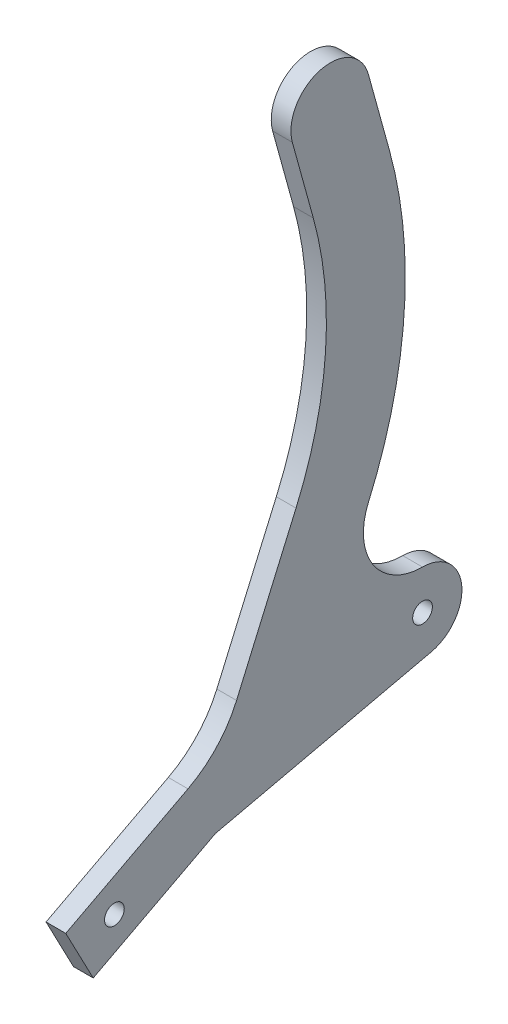
ISO-10303-21;
HEADER;
FILE_DESCRIPTION(('STEP AP214'),'2;1');
FILE_NAME('part.step','',(''),(''),'','','');
FILE_SCHEMA(('AUTOMOTIVE_DESIGN { 1 0 10303 214 1 1 1 1 }'));
ENDSEC;
DATA;
#1=APPLICATION_CONTEXT('core data for automotive mechanical design processes');
#2=APPLICATION_PROTOCOL_DEFINITION('international standard','automotive_design',2000,#1);
#3=PRODUCT_CONTEXT('',#1,'mechanical');
#4=PRODUCT('Part','Part','',(#3));
#5=PRODUCT_RELATED_PRODUCT_CATEGORY('part','',(#4));
#6=PRODUCT_DEFINITION_FORMATION('','',#4);
#7=PRODUCT_DEFINITION_CONTEXT('part definition',#1,'design');
#8=PRODUCT_DEFINITION('design','',#6,#7);
#9=PRODUCT_DEFINITION_SHAPE('','',#8);
#10=(LENGTH_UNIT() NAMED_UNIT(*) SI_UNIT(.MILLI.,.METRE.));
#11=(NAMED_UNIT(*) PLANE_ANGLE_UNIT() SI_UNIT($,.RADIAN.));
#12=(NAMED_UNIT(*) SI_UNIT($,.STERADIAN.) SOLID_ANGLE_UNIT());
#13=UNCERTAINTY_MEASURE_WITH_UNIT(LENGTH_MEASURE(1.E-05),#10,'distance_accuracy_value','');
#14=(GEOMETRIC_REPRESENTATION_CONTEXT(3) GLOBAL_UNCERTAINTY_ASSIGNED_CONTEXT((#13)) GLOBAL_UNIT_ASSIGNED_CONTEXT((#10,
#11,#12)) REPRESENTATION_CONTEXT('',''));
#15=CARTESIAN_POINT('',(0.,0.,0.));
#16=DIRECTION('',(0.,0.,1.));
#17=DIRECTION('',(1.,0.,0.));
#18=AXIS2_PLACEMENT_3D('',#15,#16,#17);
#19=CARTESIAN_POINT('',(6.35,155.517192161729,29.6872873156729));
#20=DIRECTION('',(-1.,0.,0.));
#21=DIRECTION('',(0.,0.,1.));
#22=AXIS2_PLACEMENT_3D('',#19,#20,#21);
#23=PLANE('',#22);
#24=CARTESIAN_POINT('',(6.35,155.517192161729,29.6872873156729));
#25=DIRECTION('',(1.,0.,0.));
#26=DIRECTION('',(0.,0.,1.));
#27=AXIS2_PLACEMENT_3D('',#24,#25,#26);
#28=CIRCLE('',#27,12.7);
#29=CARTESIAN_POINT('',(6.35,158.891526489611,17.4437638096035));
#30=VERTEX_POINT('',#29);
#31=CARTESIAN_POINT('',(6.35,152.142857833885,41.930810821753));
#32=VERTEX_POINT('',#31);
#33=EDGE_CURVE('E187',#30,#32,#28,.T.);
#34=ORIENTED_EDGE('',*,*,#33,.T.);
#35=DIRECTION('',(0.,-0.964056968982683,-0.26569561636565));
#36=VECTOR('',#35,1.);
#37=CARTESIAN_POINT('',(6.35,139.899334327844,38.5564764939199));
#38=LINE('',#37,#36);
#39=CARTESIAN_POINT('',(6.35,127.65581082176,35.1821421660333));
#40=VERTEX_POINT('',#39);
#41=EDGE_CURVE('E110',#32,#40,#38,.T.);
#42=ORIENTED_EDGE('',*,*,#41,.T.);
#43=CARTESIAN_POINT('',(6.35,96.4492040395704,148.413015743073));
#44=DIRECTION('',(-1.,0.,0.));
#45=DIRECTION('',(0.,0.,1.));
#46=AXIS2_PLACEMENT_3D('',#43,#44,#45);
#47=CIRCLE('',#46,117.452471399522);
#48=CARTESIAN_POINT('',(6.35,49.5130371835725,40.7464969049429));
#49=VERTEX_POINT('',#48);
#50=EDGE_CURVE('E217',#40,#49,#47,.T.);
#51=ORIENTED_EDGE('',*,*,#50,.T.);
#52=CARTESIAN_POINT('',(6.35,-8939.85125845333,-20579.8884016774));
#53=DIRECTION('',(1.,0.,0.));
#54=DIRECTION('',(0.,0.,-1.));
#55=AXIS2_PLACEMENT_3D('',#52,#53,#54);
#56=CIRCLE('',#55,22494.8717280249);
#57=CARTESIAN_POINT('',(6.35,5.43808472283835,59.9045388332975));
#58=VERTEX_POINT('',#57);
#59=EDGE_CURVE('E236',#49,#58,#56,.T.);
#60=ORIENTED_EDGE('',*,*,#59,.T.);
#61=CARTESIAN_POINT('',(6.35,19.1579657181966,91.5609215447985));
#62=DIRECTION('',(-1.,0.,0.));
#63=DIRECTION('',(0.,0.,1.));
#64=AXIS2_PLACEMENT_3D('',#61,#62,#63);
#65=CIRCLE('',#64,34.5016188159517);
#66=CARTESIAN_POINT('',(6.35,-11.4021066879984,75.5470626891276));
#67=VERTEX_POINT('',#66);
#68=EDGE_CURVE('E233',#58,#67,#65,.T.);
#69=ORIENTED_EDGE('',*,*,#68,.T.);
#70=DIRECTION('',(0.,-0.464148043055454,0.8857576384812));
#71=VECTOR('',#70,1.);
#72=CARTESIAN_POINT('',(6.35,-11.4021066879973,75.5470626891281));
#73=LINE('',#72,#71);
#74=CARTESIAN_POINT('',(6.35,-32.0334872017881,114.918989719571));
#75=VERTEX_POINT('',#74);
#76=EDGE_CURVE('E235',#67,#75,#73,.T.);
#77=ORIENTED_EDGE('',*,*,#76,.T.);
#78=DIRECTION('',(0.,-0.8857576384812,-0.464148043055454));
#79=VECTOR('',#78,1.);
#80=CARTESIAN_POINT('',(6.35,-32.0334872017881,114.918989719571));
#81=LINE('',#80,#79);
#82=CARTESIAN_POINT('',(6.35,-48.9071702148215,106.076969499382));
#83=VERTEX_POINT('',#82);
#84=EDGE_CURVE('E238',#75,#83,#81,.T.);
#85=ORIENTED_EDGE('',*,*,#84,.T.);
#86=DIRECTION('',(0.,0.464148043055454,-0.8857576384812));
#87=VECTOR('',#86,1.);
#88=CARTESIAN_POINT('',(6.35,-48.9071702148215,106.076969499382));
#89=LINE('',#88,#87);
#90=CARTESIAN_POINT('',(6.35,-28.2757897010066,66.705042468893));
#91=VERTEX_POINT('',#90);
#92=EDGE_CURVE('E244',#83,#91,#89,.T.);
#93=ORIENTED_EDGE('',*,*,#92,.T.);
#94=DIRECTION('',(0.,0.222843337829662,-0.974854269511569));
#95=VECTOR('',#94,1.);
#96=CARTESIAN_POINT('',(6.35,-28.2757897010066,66.705042468893));
#97=LINE('',#96,#95);
#98=CARTESIAN_POINT('',(6.35,-12.3806492227971,-2.83011039043598));
#99=VERTEX_POINT('',#98);
#100=EDGE_CURVE('E246',#91,#99,#97,.T.);
#101=ORIENTED_EDGE('',*,*,#100,.T.);
#102=CARTESIAN_POINT('',(6.35,0.,0.));
#103=DIRECTION('',(1.,0.,0.));
#104=DIRECTION('',(0.,0.,-1.));
#105=AXIS2_PLACEMENT_3D('',#102,#103,#104);
#106=CIRCLE('',#105,12.7000000000044);
#107=CARTESIAN_POINT('',(6.35,12.7000000000044,4.65173894454087E-11));
#108=VERTEX_POINT('',#107);
#109=EDGE_CURVE('E144',#99,#108,#106,.T.);
#110=ORIENTED_EDGE('',*,*,#109,.T.);
#111=CARTESIAN_POINT('',(6.35,31.7500000000319,1.16335480160485E-10));
#112=DIRECTION('',(-1.,0.,0.));
#113=DIRECTION('',(0.,0.,1.));
#114=AXIS2_PLACEMENT_3D('',#111,#112,#113);
#115=CIRCLE('',#114,19.0500000000426);
#116=CARTESIAN_POINT('',(6.35,39.3627302215487,17.4627843879518));
#117=VERTEX_POINT('',#116);
#118=EDGE_CURVE('E138',#108,#117,#115,.T.);
#119=ORIENTED_EDGE('',*,*,#118,.T.);
#120=CARTESIAN_POINT('',(6.35,96.4492040395463,148.41301574316));
#121=DIRECTION('',(1.,0.,0.));
#122=DIRECTION('',(0.,0.,1.));
#123=AXIS2_PLACEMENT_3D('',#120,#121,#122);
#124=CIRCLE('',#123,142.852471399592);
#125=CARTESIAN_POINT('',(6.35,134.404479477431,10.6950951539879));
#126=VERTEX_POINT('',#125);
#127=EDGE_CURVE('E142',#117,#126,#124,.T.);
#128=ORIENTED_EDGE('',*,*,#127,.T.);
#129=DIRECTION('',(0.,0.964056968982683,0.265695616365651));
#130=VECTOR('',#129,1.);
#131=CARTESIAN_POINT('',(6.35,158.891526489611,17.4437638096035));
#132=LINE('',#131,#130);
#133=EDGE_CURVE('E52',#126,#30,#132,.T.);
#134=ORIENTED_EDGE('',*,*,#133,.T.);
#135=EDGE_LOOP('',(#34,#42,#51,#60,#69,#77,#85,#93,#101,#110,#119,#128,#134));
#136=FACE_BOUND('',#135,.T.);
#137=CARTESIAN_POINT('',(6.35,0.,0.));
#138=DIRECTION('',(1.,0.,0.));
#139=DIRECTION('',(0.,0.,-1.));
#140=AXIS2_PLACEMENT_3D('',#137,#138,#139);
#141=CIRCLE('',#140,3.175);
#142=CARTESIAN_POINT('',(6.35,0.,-3.175));
#143=VERTEX_POINT('',#142);
#144=EDGE_CURVE('E166',#143,#143,#141,.T.);
#145=ORIENTED_EDGE('',*,*,#144,.F.);
#146=EDGE_LOOP('',(#145));
#147=FACE_BOUND('',#146,.T.);
#148=CARTESIAN_POINT('',(6.35,-34.5756485615007,99.2488576007703));
#149=DIRECTION('',(1.,0.,0.));
#150=DIRECTION('',(0.,0.,-1.));
#151=AXIS2_PLACEMENT_3D('',#148,#149,#150);
#152=CIRCLE('',#151,3.1749999999681);
#153=CARTESIAN_POINT('',(6.35,-34.5756485615007,96.0738576008022));
#154=VERTEX_POINT('',#153);
#155=EDGE_CURVE('E287',#154,#154,#152,.T.);
#156=ORIENTED_EDGE('',*,*,#155,.F.);
#157=EDGE_LOOP('',(#156));
#158=FACE_BOUND('',#157,.T.);
#159=ADVANCED_FACE('F35',(#136,#147,#158),#23,.F.);
#160=CARTESIAN_POINT('',(0.,155.517192161729,29.6872873156729));
#161=DIRECTION('',(-1.,0.,0.));
#162=DIRECTION('',(0.,0.,1.));
#163=AXIS2_PLACEMENT_3D('',#160,#161,#162);
#164=PLANE('',#163);
#165=CARTESIAN_POINT('',(0.,0.,0.));
#166=DIRECTION('',(1.,0.,0.));
#167=DIRECTION('',(0.,0.,-1.));
#168=AXIS2_PLACEMENT_3D('',#165,#166,#167);
#169=CIRCLE('',#168,3.175);
#170=CARTESIAN_POINT('',(0.,0.,-3.175));
#171=VERTEX_POINT('',#170);
#172=EDGE_CURVE('E292',#171,#171,#169,.T.);
#173=ORIENTED_EDGE('',*,*,#172,.T.);
#174=EDGE_LOOP('',(#173));
#175=FACE_BOUND('',#174,.T.);
#176=CARTESIAN_POINT('',(0.,155.517192161729,29.6872873156729));
#177=DIRECTION('',(1.,0.,0.));
#178=DIRECTION('',(0.,0.,1.));
#179=AXIS2_PLACEMENT_3D('',#176,#177,#178);
#180=CIRCLE('',#179,12.7);
#181=CARTESIAN_POINT('',(0.,158.891526489611,17.4437638096035));
#182=VERTEX_POINT('',#181);
#183=CARTESIAN_POINT('',(0.,152.142857833885,41.930810821753));
#184=VERTEX_POINT('',#183);
#185=EDGE_CURVE('E162',#182,#184,#180,.T.);
#186=ORIENTED_EDGE('',*,*,#185,.F.);
#187=DIRECTION('',(0.,0.964056968982683,0.265695616365651));
#188=VECTOR('',#187,1.);
#189=CARTESIAN_POINT('',(0.,158.891526489611,17.4437638096035));
#190=LINE('',#189,#188);
#191=CARTESIAN_POINT('',(0.,134.404479477431,10.6950951539879));
#192=VERTEX_POINT('',#191);
#193=EDGE_CURVE('E102',#192,#182,#190,.T.);
#194=ORIENTED_EDGE('',*,*,#193,.F.);
#195=CARTESIAN_POINT('',(0.,96.4492040395463,148.41301574316));
#196=DIRECTION('',(1.,0.,0.));
#197=DIRECTION('',(0.,0.,1.));
#198=AXIS2_PLACEMENT_3D('',#195,#196,#197);
#199=CIRCLE('',#198,142.852471399592);
#200=CARTESIAN_POINT('',(0.,39.3627302215487,17.4627843879518));
#201=VERTEX_POINT('',#200);
#202=EDGE_CURVE('E96',#201,#192,#199,.T.);
#203=ORIENTED_EDGE('',*,*,#202,.F.);
#204=CARTESIAN_POINT('',(0.,31.7500000000319,1.16335480160485E-10));
#205=DIRECTION('',(-1.,0.,0.));
#206=DIRECTION('',(0.,0.,1.));
#207=AXIS2_PLACEMENT_3D('',#204,#205,#206);
#208=CIRCLE('',#207,19.0500000000426);
#209=CARTESIAN_POINT('',(0.,12.7000000000044,4.65173894454087E-11));
#210=VERTEX_POINT('',#209);
#211=EDGE_CURVE('E152',#210,#201,#208,.T.);
#212=ORIENTED_EDGE('',*,*,#211,.F.);
#213=CARTESIAN_POINT('',(0.,0.,0.));
#214=DIRECTION('',(1.,0.,0.));
#215=DIRECTION('',(0.,0.,-1.));
#216=AXIS2_PLACEMENT_3D('',#213,#214,#215);
#217=CIRCLE('',#216,12.7000000000044);
#218=CARTESIAN_POINT('',(0.,-12.3806492227971,-2.83011039043598));
#219=VERTEX_POINT('',#218);
#220=EDGE_CURVE('E182',#219,#210,#217,.T.);
#221=ORIENTED_EDGE('',*,*,#220,.F.);
#222=DIRECTION('',(0.,0.222843337829662,-0.974854269511569));
#223=VECTOR('',#222,1.);
#224=CARTESIAN_POINT('',(0.,-28.2757897010066,66.705042468893));
#225=LINE('',#224,#223);
#226=CARTESIAN_POINT('',(0.,-28.2757897010066,66.705042468893));
#227=VERTEX_POINT('',#226);
#228=EDGE_CURVE('E180',#227,#219,#225,.T.);
#229=ORIENTED_EDGE('',*,*,#228,.F.);
#230=DIRECTION('',(0.,0.464148043055454,-0.8857576384812));
#231=VECTOR('',#230,1.);
#232=CARTESIAN_POINT('',(0.,-48.9071702148215,106.076969499382));
#233=LINE('',#232,#231);
#234=CARTESIAN_POINT('',(0.,-48.9071702148215,106.076969499382));
#235=VERTEX_POINT('',#234);
#236=EDGE_CURVE('E178',#235,#227,#233,.T.);
#237=ORIENTED_EDGE('',*,*,#236,.F.);
#238=DIRECTION('',(0.,-0.8857576384812,-0.464148043055454));
#239=VECTOR('',#238,1.);
#240=CARTESIAN_POINT('',(0.,-32.0334872017881,114.918989719571));
#241=LINE('',#240,#239);
#242=CARTESIAN_POINT('',(0.,-32.0334872017881,114.918989719571));
#243=VERTEX_POINT('',#242);
#244=EDGE_CURVE('E176',#243,#235,#241,.T.);
#245=ORIENTED_EDGE('',*,*,#244,.F.);
#246=DIRECTION('',(0.,-0.464148043055454,0.8857576384812));
#247=VECTOR('',#246,1.);
#248=CARTESIAN_POINT('',(0.,-11.4021066879973,75.5470626891281));
#249=LINE('',#248,#247);
#250=CARTESIAN_POINT('',(0.,-11.4021066879984,75.5470626891276));
#251=VERTEX_POINT('',#250);
#252=EDGE_CURVE('E174',#251,#243,#249,.T.);
#253=ORIENTED_EDGE('',*,*,#252,.F.);
#254=CARTESIAN_POINT('',(0.,19.1579657181966,91.5609215447985));
#255=DIRECTION('',(-1.,0.,0.));
#256=DIRECTION('',(0.,0.,1.));
#257=AXIS2_PLACEMENT_3D('',#254,#255,#256);
#258=CIRCLE('',#257,34.5016188159517);
#259=CARTESIAN_POINT('',(0.,5.43808472283835,59.9045388332975));
#260=VERTEX_POINT('',#259);
#261=EDGE_CURVE('E172',#260,#251,#258,.T.);
#262=ORIENTED_EDGE('',*,*,#261,.F.);
#263=CARTESIAN_POINT('',(0.,-8939.85125845333,-20579.8884016774));
#264=DIRECTION('',(1.,0.,0.));
#265=DIRECTION('',(0.,0.,-1.));
#266=AXIS2_PLACEMENT_3D('',#263,#264,#265);
#267=CIRCLE('',#266,22494.8717280249);
#268=CARTESIAN_POINT('',(0.,49.5130371835725,40.7464969049429));
#269=VERTEX_POINT('',#268);
#270=EDGE_CURVE('E170',#269,#260,#267,.T.);
#271=ORIENTED_EDGE('',*,*,#270,.F.);
#272=CARTESIAN_POINT('',(0.,96.4492040395704,148.413015743073));
#273=DIRECTION('',(-1.,0.,0.));
#274=DIRECTION('',(0.,0.,1.));
#275=AXIS2_PLACEMENT_3D('',#272,#273,#274);
#276=CIRCLE('',#275,117.452471399522);
#277=CARTESIAN_POINT('',(0.,127.65581082176,35.1821421660333));
#278=VERTEX_POINT('',#277);
#279=EDGE_CURVE('E168',#278,#269,#276,.T.);
#280=ORIENTED_EDGE('',*,*,#279,.F.);
#281=DIRECTION('',(0.,-0.964056968981837,-0.265695616368718));
#282=VECTOR('',#281,1.);
#283=CARTESIAN_POINT('',(0.,139.899334327844,38.5564764939199));
#284=LINE('',#283,#282);
#285=EDGE_CURVE('E165',#184,#278,#284,.T.);
#286=ORIENTED_EDGE('',*,*,#285,.F.);
#287=EDGE_LOOP('',(#186,#194,#203,#212,#221,#229,#237,#245,#253,#262,#271,#280,#286));
#288=FACE_BOUND('',#287,.T.);
#289=CARTESIAN_POINT('',(0.,-34.5756485615007,99.2488576007703));
#290=DIRECTION('',(1.,0.,0.));
#291=DIRECTION('',(0.,0.,-1.));
#292=AXIS2_PLACEMENT_3D('',#289,#290,#291);
#293=CIRCLE('',#292,3.1749999999681);
#294=CARTESIAN_POINT('',(0.,-34.5756485615007,96.0738576008022));
#295=VERTEX_POINT('',#294);
#296=EDGE_CURVE('E290',#295,#295,#293,.T.);
#297=ORIENTED_EDGE('',*,*,#296,.T.);
#298=EDGE_LOOP('',(#297));
#299=FACE_BOUND('',#298,.T.);
#300=ADVANCED_FACE('F221',(#175,#288,#299),#164,.T.);
#301=CARTESIAN_POINT('',(6.35,155.517192161729,29.6872873156729));
#302=DIRECTION('',(-1.,0.,0.));
#303=DIRECTION('',(0.,0.,1.));
#304=AXIS2_PLACEMENT_3D('',#301,#302,#303);
#305=CYLINDRICAL_SURFACE('',#304,12.7);
#306=ORIENTED_EDGE('',*,*,#185,.T.);
#307=DIRECTION('',(-1.,0.,0.));
#308=VECTOR('',#307,1.);
#309=CARTESIAN_POINT('',(6.35,152.142857833885,41.930810821753));
#310=LINE('',#309,#308);
#311=EDGE_CURVE('E11',#32,#184,#310,.T.);
#312=ORIENTED_EDGE('',*,*,#311,.F.);
#313=ORIENTED_EDGE('',*,*,#33,.F.);
#314=DIRECTION('',(-1.,0.,0.));
#315=VECTOR('',#314,1.);
#316=CARTESIAN_POINT('',(6.35,158.891526489611,17.4437638096035));
#317=LINE('',#316,#315);
#318=EDGE_CURVE('E158',#30,#182,#317,.T.);
#319=ORIENTED_EDGE('',*,*,#318,.T.);
#320=EDGE_LOOP('',(#306,#312,#313,#319));
#321=FACE_BOUND('',#320,.T.);
#322=ADVANCED_FACE('F37',(#321),#305,.T.);
#323=CARTESIAN_POINT('',(6.35,139.899334327844,38.5564764939199));
#324=DIRECTION('',(0.,0.265695616368718,-0.964056968981837));
#325=DIRECTION('',(0.,0.964056968981837,0.265695616368718));
#326=AXIS2_PLACEMENT_3D('',#323,#324,#325);
#327=PLANE('',#326);
#328=ORIENTED_EDGE('',*,*,#285,.T.);
#329=DIRECTION('',(-1.,0.,0.));
#330=VECTOR('',#329,1.);
#331=CARTESIAN_POINT('',(6.35,127.65581082176,35.1821421660333));
#332=LINE('',#331,#330);
#333=EDGE_CURVE('E44',#40,#278,#332,.T.);
#334=ORIENTED_EDGE('',*,*,#333,.F.);
#335=ORIENTED_EDGE('',*,*,#41,.F.);
#336=ORIENTED_EDGE('',*,*,#311,.T.);
#337=EDGE_LOOP('',(#328,#334,#335,#336));
#338=FACE_BOUND('',#337,.T.);
#339=ADVANCED_FACE('F397',(#338),#327,.F.);
#340=CARTESIAN_POINT('',(6.35,96.4492040395704,148.413015743073));
#341=DIRECTION('',(-1.,0.,0.));
#342=DIRECTION('',(0.,0.,1.));
#343=AXIS2_PLACEMENT_3D('',#340,#341,#342);
#344=CYLINDRICAL_SURFACE('',#343,117.452471399522);
#345=ORIENTED_EDGE('',*,*,#279,.T.);
#346=DIRECTION('',(-1.,0.,0.));
#347=VECTOR('',#346,1.);
#348=CARTESIAN_POINT('',(6.35,49.5130371835725,40.7464969049429));
#349=LINE('',#348,#347);
#350=EDGE_CURVE('E209',#49,#269,#349,.T.);
#351=ORIENTED_EDGE('',*,*,#350,.F.);
#352=ORIENTED_EDGE('',*,*,#50,.F.);
#353=ORIENTED_EDGE('',*,*,#333,.T.);
#354=EDGE_LOOP('',(#345,#351,#352,#353));
#355=FACE_BOUND('',#354,.T.);
#356=ADVANCED_FACE('F215',(#355),#344,.F.);
#357=CARTESIAN_POINT('',(6.35,-8939.85125845333,-20579.8884016774));
#358=DIRECTION('',(-1.,0.,0.));
#359=DIRECTION('',(0.,0.,1.));
#360=AXIS2_PLACEMENT_3D('',#357,#358,#359);
#361=CYLINDRICAL_SURFACE('',#360,22494.8717280249);
#362=ORIENTED_EDGE('',*,*,#270,.T.);
#363=DIRECTION('',(-1.,0.,0.));
#364=VECTOR('',#363,1.);
#365=CARTESIAN_POINT('',(6.35,5.43808472283835,59.9045388332975));
#366=LINE('',#365,#364);
#367=EDGE_CURVE('E206',#58,#260,#366,.T.);
#368=ORIENTED_EDGE('',*,*,#367,.F.);
#369=ORIENTED_EDGE('',*,*,#59,.F.);
#370=ORIENTED_EDGE('',*,*,#350,.T.);
#371=EDGE_LOOP('',(#362,#368,#369,#370));
#372=FACE_BOUND('',#371,.T.);
#373=ADVANCED_FACE('F227',(#372),#361,.T.);
#374=CARTESIAN_POINT('',(6.35,19.1579657181966,91.5609215447985));
#375=DIRECTION('',(-1.,0.,0.));
#376=DIRECTION('',(0.,0.,1.));
#377=AXIS2_PLACEMENT_3D('',#374,#375,#376);
#378=CYLINDRICAL_SURFACE('',#377,34.5016188159517);
#379=ORIENTED_EDGE('',*,*,#261,.T.);
#380=DIRECTION('',(-1.,0.,0.));
#381=VECTOR('',#380,1.);
#382=CARTESIAN_POINT('',(6.35,-11.4021066879984,75.5470626891276));
#383=LINE('',#382,#381);
#384=EDGE_CURVE('E203',#67,#251,#383,.T.);
#385=ORIENTED_EDGE('',*,*,#384,.F.);
#386=ORIENTED_EDGE('',*,*,#68,.F.);
#387=ORIENTED_EDGE('',*,*,#367,.T.);
#388=EDGE_LOOP('',(#379,#385,#386,#387));
#389=FACE_BOUND('',#388,.T.);
#390=ADVANCED_FACE('F231',(#389),#378,.F.);
#391=CARTESIAN_POINT('',(6.35,-11.4021066879973,75.5470626891281));
#392=DIRECTION('',(0.,-0.8857576384812,-0.464148043055454));
#393=DIRECTION('',(0.,0.464148043055454,-0.8857576384812));
#394=AXIS2_PLACEMENT_3D('',#391,#392,#393);
#395=PLANE('',#394);
#396=ORIENTED_EDGE('',*,*,#252,.T.);
#397=DIRECTION('',(-1.,0.,0.));
#398=VECTOR('',#397,1.);
#399=CARTESIAN_POINT('',(6.35,-32.0334872017881,114.918989719571));
#400=LINE('',#399,#398);
#401=EDGE_CURVE('E200',#75,#243,#400,.T.);
#402=ORIENTED_EDGE('',*,*,#401,.F.);
#403=ORIENTED_EDGE('',*,*,#76,.F.);
#404=ORIENTED_EDGE('',*,*,#384,.T.);
#405=EDGE_LOOP('',(#396,#402,#403,#404));
#406=FACE_BOUND('',#405,.T.);
#407=ADVANCED_FACE('F362',(#406),#395,.F.);
#408=CARTESIAN_POINT('',(6.35,-32.0334872017881,114.918989719571));
#409=DIRECTION('',(0.,0.464148043055454,-0.8857576384812));
#410=DIRECTION('',(0.,0.8857576384812,0.464148043055454));
#411=AXIS2_PLACEMENT_3D('',#408,#409,#410);
#412=PLANE('',#411);
#413=ORIENTED_EDGE('',*,*,#244,.T.);
#414=DIRECTION('',(-1.,0.,0.));
#415=VECTOR('',#414,1.);
#416=CARTESIAN_POINT('',(6.35,-48.9071702148215,106.076969499382));
#417=LINE('',#416,#415);
#418=EDGE_CURVE('E197',#83,#235,#417,.T.);
#419=ORIENTED_EDGE('',*,*,#418,.F.);
#420=ORIENTED_EDGE('',*,*,#84,.F.);
#421=ORIENTED_EDGE('',*,*,#401,.T.);
#422=EDGE_LOOP('',(#413,#419,#420,#421));
#423=FACE_BOUND('',#422,.T.);
#424=ADVANCED_FACE('F352',(#423),#412,.F.);
#425=CARTESIAN_POINT('',(6.35,-48.9071702148215,106.076969499382));
#426=DIRECTION('',(0.,0.8857576384812,0.464148043055454));
#427=DIRECTION('',(0.,-0.464148043055454,0.8857576384812));
#428=AXIS2_PLACEMENT_3D('',#425,#426,#427);
#429=PLANE('',#428);
#430=ORIENTED_EDGE('',*,*,#236,.T.);
#431=DIRECTION('',(-1.,0.,0.));
#432=VECTOR('',#431,1.);
#433=CARTESIAN_POINT('',(6.35,-28.2757897010066,66.705042468893));
#434=LINE('',#433,#432);
#435=EDGE_CURVE('E194',#91,#227,#434,.T.);
#436=ORIENTED_EDGE('',*,*,#435,.F.);
#437=ORIENTED_EDGE('',*,*,#92,.F.);
#438=ORIENTED_EDGE('',*,*,#418,.T.);
#439=EDGE_LOOP('',(#430,#436,#437,#438));
#440=FACE_BOUND('',#439,.T.);
#441=ADVANCED_FACE('F343',(#440),#429,.F.);
#442=CARTESIAN_POINT('',(6.35,-28.2757897010066,66.705042468893));
#443=DIRECTION('',(0.,0.974854269511569,0.222843337829662));
#444=DIRECTION('',(0.,-0.222843337829662,0.974854269511569));
#445=AXIS2_PLACEMENT_3D('',#442,#443,#444);
#446=PLANE('',#445);
#447=ORIENTED_EDGE('',*,*,#228,.T.);
#448=DIRECTION('',(-1.,0.,0.));
#449=VECTOR('',#448,1.);
#450=CARTESIAN_POINT('',(6.35,-12.3806492227971,-2.83011039043598));
#451=LINE('',#450,#449);
#452=EDGE_CURVE('E191',#99,#219,#451,.T.);
#453=ORIENTED_EDGE('',*,*,#452,.F.);
#454=ORIENTED_EDGE('',*,*,#100,.F.);
#455=ORIENTED_EDGE('',*,*,#435,.T.);
#456=EDGE_LOOP('',(#447,#453,#454,#455));
#457=FACE_BOUND('',#456,.T.);
#458=ADVANCED_FACE('F252',(#457),#446,.F.);
#459=CARTESIAN_POINT('',(6.35,0.,0.));
#460=DIRECTION('',(-1.,0.,0.));
#461=DIRECTION('',(0.,0.,1.));
#462=AXIS2_PLACEMENT_3D('',#459,#460,#461);
#463=CYLINDRICAL_SURFACE('',#462,12.7000000000044);
#464=ORIENTED_EDGE('',*,*,#220,.T.);
#465=DIRECTION('',(-1.,0.,0.));
#466=VECTOR('',#465,1.);
#467=CARTESIAN_POINT('',(6.35,12.7000000000044,4.65173894454087E-11));
#468=LINE('',#467,#466);
#469=EDGE_CURVE('E153',#108,#210,#468,.T.);
#470=ORIENTED_EDGE('',*,*,#469,.F.);
#471=ORIENTED_EDGE('',*,*,#109,.F.);
#472=ORIENTED_EDGE('',*,*,#452,.T.);
#473=EDGE_LOOP('',(#464,#470,#471,#472));
#474=FACE_BOUND('',#473,.T.);
#475=ADVANCED_FACE('F256',(#474),#463,.T.);
#476=CARTESIAN_POINT('',(6.35,31.7500000000319,1.16335480160485E-10));
#477=DIRECTION('',(-1.,0.,0.));
#478=DIRECTION('',(0.,0.,1.));
#479=AXIS2_PLACEMENT_3D('',#476,#477,#478);
#480=CYLINDRICAL_SURFACE('',#479,19.0500000000426);
#481=ORIENTED_EDGE('',*,*,#211,.T.);
#482=DIRECTION('',(-1.,0.,0.));
#483=VECTOR('',#482,1.);
#484=CARTESIAN_POINT('',(6.35,39.3627302215487,17.4627843879518));
#485=LINE('',#484,#483);
#486=EDGE_CURVE('E149',#117,#201,#485,.T.);
#487=ORIENTED_EDGE('',*,*,#486,.F.);
#488=ORIENTED_EDGE('',*,*,#118,.F.);
#489=ORIENTED_EDGE('',*,*,#469,.T.);
#490=EDGE_LOOP('',(#481,#487,#488,#489));
#491=FACE_BOUND('',#490,.T.);
#492=ADVANCED_FACE('F150',(#491),#480,.F.);
#493=CARTESIAN_POINT('',(6.35,96.4492040395463,148.41301574316));
#494=DIRECTION('',(-1.,0.,0.));
#495=DIRECTION('',(0.,0.,1.));
#496=AXIS2_PLACEMENT_3D('',#493,#494,#495);
#497=CYLINDRICAL_SURFACE('',#496,142.852471399592);
#498=ORIENTED_EDGE('',*,*,#202,.T.);
#499=DIRECTION('',(-1.,0.,0.));
#500=VECTOR('',#499,1.);
#501=CARTESIAN_POINT('',(6.35,134.404479477431,10.6950951539879));
#502=LINE('',#501,#500);
#503=EDGE_CURVE('E154',#126,#192,#502,.T.);
#504=ORIENTED_EDGE('',*,*,#503,.F.);
#505=ORIENTED_EDGE('',*,*,#127,.F.);
#506=ORIENTED_EDGE('',*,*,#486,.T.);
#507=EDGE_LOOP('',(#498,#504,#505,#506));
#508=FACE_BOUND('',#507,.T.);
#509=ADVANCED_FACE('F156',(#508),#497,.T.);
#510=CARTESIAN_POINT('',(6.35,158.891526489611,17.4437638096035));
#511=DIRECTION('',(0.,-0.26569561636565,0.964056968982682));
#512=DIRECTION('',(0.,-0.964056968982683,-0.265695616365651));
#513=AXIS2_PLACEMENT_3D('',#510,#511,#512);
#514=PLANE('',#513);
#515=ORIENTED_EDGE('',*,*,#193,.T.);
#516=ORIENTED_EDGE('',*,*,#318,.F.);
#517=ORIENTED_EDGE('',*,*,#133,.F.);
#518=ORIENTED_EDGE('',*,*,#503,.T.);
#519=EDGE_LOOP('',(#515,#516,#517,#518));
#520=FACE_BOUND('',#519,.T.);
#521=ADVANCED_FACE('F260',(#520),#514,.F.);
#522=CARTESIAN_POINT('',(6.35,0.,0.));
#523=DIRECTION('',(-1.,0.,0.));
#524=DIRECTION('',(0.,0.,1.));
#525=AXIS2_PLACEMENT_3D('',#522,#523,#524);
#526=CYLINDRICAL_SURFACE('',#525,3.175);
#527=ORIENTED_EDGE('',*,*,#144,.T.);
#528=EDGE_LOOP('',(#527));
#529=FACE_BOUND('',#528,.T.);
#530=ORIENTED_EDGE('',*,*,#172,.F.);
#531=EDGE_LOOP('',(#530));
#532=FACE_BOUND('',#531,.T.);
#533=ADVANCED_FACE('F262',(#529,#532),#526,.F.);
#534=CARTESIAN_POINT('',(6.35,-34.5756485615007,99.2488576007703));
#535=DIRECTION('',(-1.,0.,0.));
#536=DIRECTION('',(0.,0.,1.));
#537=AXIS2_PLACEMENT_3D('',#534,#535,#536);
#538=CYLINDRICAL_SURFACE('',#537,3.1749999999681);
#539=ORIENTED_EDGE('',*,*,#155,.T.);
#540=EDGE_LOOP('',(#539));
#541=FACE_BOUND('',#540,.T.);
#542=ORIENTED_EDGE('',*,*,#296,.F.);
#543=EDGE_LOOP('',(#542));
#544=FACE_BOUND('',#543,.T.);
#545=ADVANCED_FACE('F268',(#541,#544),#538,.F.);
#546=CLOSED_SHELL('',(#159,#300,#322,#339,#356,#373,#390,#407,#424,#441,#458,#475,#492,#509,
#521,#533,#545));
#547=MANIFOLD_SOLID_BREP('B2',#546);
#548=ADVANCED_BREP_SHAPE_REPRESENTATION('',(#18,#547),#14);
#549=SHAPE_DEFINITION_REPRESENTATION(#9,#548);
ENDSEC;
END-ISO-10303-21;
